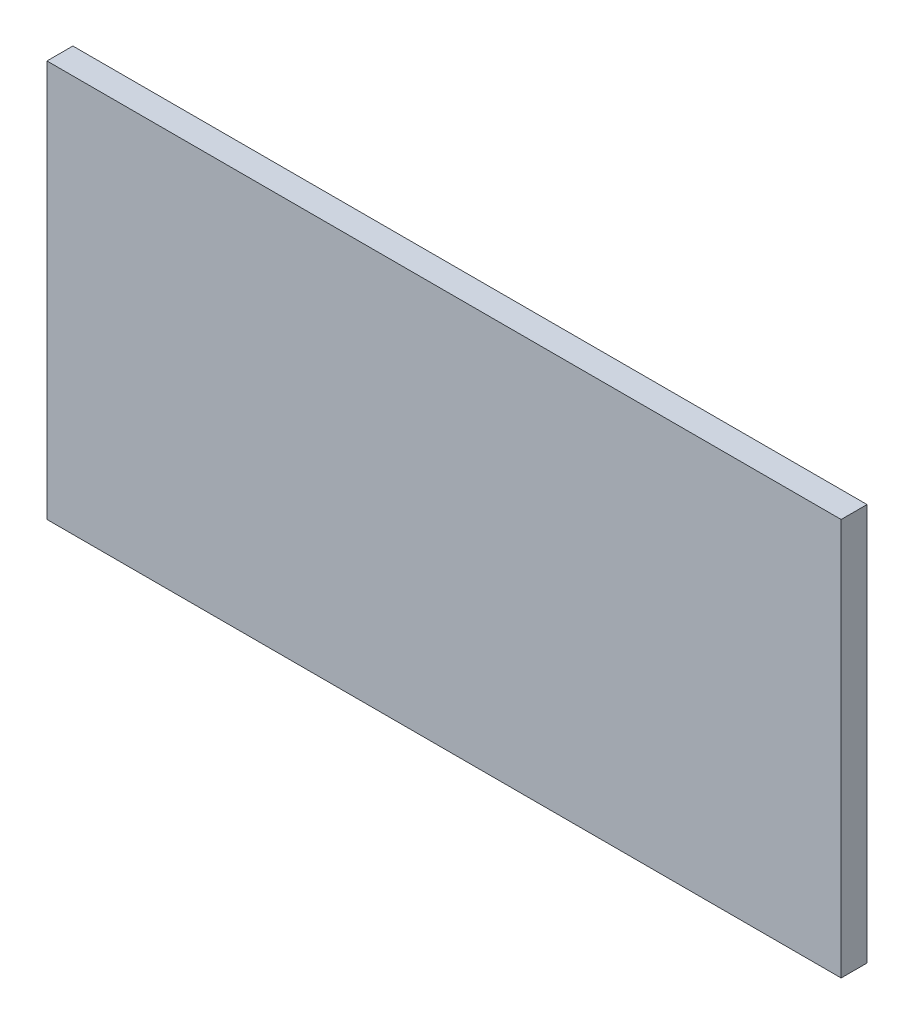
ISO-10303-21;
HEADER;
FILE_DESCRIPTION(('STEP AP214'),'2;1');
FILE_NAME('part.step','',(''),(''),'','','');
FILE_SCHEMA(('AUTOMOTIVE_DESIGN { 1 0 10303 214 1 1 1 1 }'));
ENDSEC;
DATA;
#1=APPLICATION_CONTEXT('core data for automotive mechanical design processes');
#2=APPLICATION_PROTOCOL_DEFINITION('international standard','automotive_design',2000,#1);
#3=PRODUCT_CONTEXT('',#1,'mechanical');
#4=PRODUCT('Part','Part','',(#3));
#5=PRODUCT_RELATED_PRODUCT_CATEGORY('part','',(#4));
#6=PRODUCT_DEFINITION_FORMATION('','',#4);
#7=PRODUCT_DEFINITION_CONTEXT('part definition',#1,'design');
#8=PRODUCT_DEFINITION('design','',#6,#7);
#9=PRODUCT_DEFINITION_SHAPE('','',#8);
#10=(LENGTH_UNIT() NAMED_UNIT(*) SI_UNIT(.MILLI.,.METRE.));
#11=(NAMED_UNIT(*) PLANE_ANGLE_UNIT() SI_UNIT($,.RADIAN.));
#12=(NAMED_UNIT(*) SI_UNIT($,.STERADIAN.) SOLID_ANGLE_UNIT());
#13=UNCERTAINTY_MEASURE_WITH_UNIT(LENGTH_MEASURE(1.E-05),#10,'distance_accuracy_value','');
#14=(GEOMETRIC_REPRESENTATION_CONTEXT(3) GLOBAL_UNCERTAINTY_ASSIGNED_CONTEXT((#13)) GLOBAL_UNIT_ASSIGNED_CONTEXT((#10,
#11,#12)) REPRESENTATION_CONTEXT('',''));
#15=CARTESIAN_POINT('',(0.,0.,0.));
#16=DIRECTION('',(0.,0.,1.));
#17=DIRECTION('',(1.,0.,0.));
#18=AXIS2_PLACEMENT_3D('',#15,#16,#17);
#19=CARTESIAN_POINT('',(46.,23.,3.));
#20=DIRECTION('',(-1.,0.,0.));
#21=DIRECTION('',(0.,-1.,0.));
#22=AXIS2_PLACEMENT_3D('',#19,#20,#21);
#23=PLANE('',#22);
#24=DIRECTION('',(0.,1.,0.));
#25=VECTOR('',#24,1.);
#26=CARTESIAN_POINT('',(46.,23.,0.));
#27=LINE('',#26,#25);
#28=CARTESIAN_POINT('',(46.,-23.,0.));
#29=VERTEX_POINT('',#28);
#30=CARTESIAN_POINT('',(46.,23.,0.));
#31=VERTEX_POINT('',#30);
#32=EDGE_CURVE('E96',#29,#31,#27,.T.);
#33=ORIENTED_EDGE('',*,*,#32,.T.);
#34=DIRECTION('',(0.,0.,-1.));
#35=VECTOR('',#34,1.);
#36=CARTESIAN_POINT('',(46.,23.,3.));
#37=LINE('',#36,#35);
#38=CARTESIAN_POINT('',(46.,23.,3.));
#39=VERTEX_POINT('',#38);
#40=EDGE_CURVE('E11',#39,#31,#37,.T.);
#41=ORIENTED_EDGE('',*,*,#40,.F.);
#42=DIRECTION('',(0.,1.,0.));
#43=VECTOR('',#42,1.);
#44=CARTESIAN_POINT('',(46.,23.,3.));
#45=LINE('',#44,#43);
#46=CARTESIAN_POINT('',(46.,-23.,3.));
#47=VERTEX_POINT('',#46);
#48=EDGE_CURVE('E84',#47,#39,#45,.T.);
#49=ORIENTED_EDGE('',*,*,#48,.F.);
#50=DIRECTION('',(0.,0.,-1.));
#51=VECTOR('',#50,1.);
#52=CARTESIAN_POINT('',(46.,-23.,3.));
#53=LINE('',#52,#51);
#54=EDGE_CURVE('E92',#47,#29,#53,.T.);
#55=ORIENTED_EDGE('',*,*,#54,.T.);
#56=EDGE_LOOP('',(#33,#41,#49,#55));
#57=FACE_BOUND('',#56,.T.);
#58=ADVANCED_FACE('F33',(#57),#23,.F.);
#59=CARTESIAN_POINT('',(-46.,23.,3.));
#60=DIRECTION('',(0.,-1.,0.));
#61=DIRECTION('',(0.,0.,-1.));
#62=AXIS2_PLACEMENT_3D('',#59,#60,#61);
#63=PLANE('',#62);
#64=DIRECTION('',(-1.,0.,0.));
#65=VECTOR('',#64,1.);
#66=CARTESIAN_POINT('',(-46.,23.,0.));
#67=LINE('',#66,#65);
#68=CARTESIAN_POINT('',(-46.,23.,0.));
#69=VERTEX_POINT('',#68);
#70=EDGE_CURVE('E88',#31,#69,#67,.T.);
#71=ORIENTED_EDGE('',*,*,#70,.T.);
#72=DIRECTION('',(0.,0.,-1.));
#73=VECTOR('',#72,1.);
#74=CARTESIAN_POINT('',(-46.,23.,3.));
#75=LINE('',#74,#73);
#76=CARTESIAN_POINT('',(-46.,23.,3.));
#77=VERTEX_POINT('',#76);
#78=EDGE_CURVE('E41',#77,#69,#75,.T.);
#79=ORIENTED_EDGE('',*,*,#78,.F.);
#80=DIRECTION('',(-1.,0.,0.));
#81=VECTOR('',#80,1.);
#82=CARTESIAN_POINT('',(-46.,23.,3.));
#83=LINE('',#82,#81);
#84=EDGE_CURVE('E79',#39,#77,#83,.T.);
#85=ORIENTED_EDGE('',*,*,#84,.F.);
#86=ORIENTED_EDGE('',*,*,#40,.T.);
#87=EDGE_LOOP('',(#71,#79,#85,#86));
#88=FACE_BOUND('',#87,.T.);
#89=ADVANCED_FACE('F87',(#88),#63,.F.);
#90=CARTESIAN_POINT('',(-46.,23.,3.));
#91=DIRECTION('',(1.,0.,0.));
#92=DIRECTION('',(0.,1.,0.));
#93=AXIS2_PLACEMENT_3D('',#90,#91,#92);
#94=PLANE('',#93);
#95=DIRECTION('',(0.,-1.,0.));
#96=VECTOR('',#95,1.);
#97=CARTESIAN_POINT('',(-46.,23.,0.));
#98=LINE('',#97,#96);
#99=CARTESIAN_POINT('',(-46.,-23.,0.));
#100=VERTEX_POINT('',#99);
#101=EDGE_CURVE('E66',#69,#100,#98,.T.);
#102=ORIENTED_EDGE('',*,*,#101,.T.);
#103=DIRECTION('',(0.,0.,-1.));
#104=VECTOR('',#103,1.);
#105=CARTESIAN_POINT('',(-46.,-23.,3.));
#106=LINE('',#105,#104);
#107=CARTESIAN_POINT('',(-46.,-23.,3.));
#108=VERTEX_POINT('',#107);
#109=EDGE_CURVE('E89',#108,#100,#106,.T.);
#110=ORIENTED_EDGE('',*,*,#109,.F.);
#111=DIRECTION('',(0.,-1.,0.));
#112=VECTOR('',#111,1.);
#113=CARTESIAN_POINT('',(-46.,23.,3.));
#114=LINE('',#113,#112);
#115=EDGE_CURVE('E82',#77,#108,#114,.T.);
#116=ORIENTED_EDGE('',*,*,#115,.F.);
#117=ORIENTED_EDGE('',*,*,#78,.T.);
#118=EDGE_LOOP('',(#102,#110,#116,#117));
#119=FACE_BOUND('',#118,.T.);
#120=ADVANCED_FACE('F90',(#119),#94,.F.);
#121=CARTESIAN_POINT('',(-46.,-23.,3.));
#122=DIRECTION('',(0.,1.,0.));
#123=DIRECTION('',(0.,0.,1.));
#124=AXIS2_PLACEMENT_3D('',#121,#122,#123);
#125=PLANE('',#124);
#126=DIRECTION('',(1.,0.,0.));
#127=VECTOR('',#126,1.);
#128=CARTESIAN_POINT('',(-46.,-23.,0.));
#129=LINE('',#128,#127);
#130=EDGE_CURVE('E72',#100,#29,#129,.T.);
#131=ORIENTED_EDGE('',*,*,#130,.T.);
#132=ORIENTED_EDGE('',*,*,#54,.F.);
#133=DIRECTION('',(1.,0.,0.));
#134=VECTOR('',#133,1.);
#135=CARTESIAN_POINT('',(-46.,-23.,3.));
#136=LINE('',#135,#134);
#137=EDGE_CURVE('E49',#108,#47,#136,.T.);
#138=ORIENTED_EDGE('',*,*,#137,.F.);
#139=ORIENTED_EDGE('',*,*,#109,.T.);
#140=EDGE_LOOP('',(#131,#132,#138,#139));
#141=FACE_BOUND('',#140,.T.);
#142=ADVANCED_FACE('F103',(#141),#125,.F.);
#143=CARTESIAN_POINT('',(0.,0.,3.));
#144=DIRECTION('',(0.,0.,1.));
#145=DIRECTION('',(1.,0.,0.));
#146=AXIS2_PLACEMENT_3D('',#143,#144,#145);
#147=PLANE('',#146);
#148=ORIENTED_EDGE('',*,*,#48,.T.);
#149=ORIENTED_EDGE('',*,*,#84,.T.);
#150=ORIENTED_EDGE('',*,*,#115,.T.);
#151=ORIENTED_EDGE('',*,*,#137,.T.);
#152=EDGE_LOOP('',(#148,#149,#150,#151));
#153=FACE_BOUND('',#152,.T.);
#154=ADVANCED_FACE('F80',(#153),#147,.T.);
#155=CARTESIAN_POINT('',(0.,0.,0.));
#156=DIRECTION('',(0.,0.,1.));
#157=DIRECTION('',(1.,0.,0.));
#158=AXIS2_PLACEMENT_3D('',#155,#156,#157);
#159=PLANE('',#158);
#160=ORIENTED_EDGE('',*,*,#32,.F.);
#161=ORIENTED_EDGE('',*,*,#130,.F.);
#162=ORIENTED_EDGE('',*,*,#101,.F.);
#163=ORIENTED_EDGE('',*,*,#70,.F.);
#164=EDGE_LOOP('',(#160,#161,#162,#163));
#165=FACE_BOUND('',#164,.T.);
#166=ADVANCED_FACE('F106',(#165),#159,.F.);
#167=CLOSED_SHELL('',(#58,#89,#120,#142,#154,#166));
#168=MANIFOLD_SOLID_BREP('B2',#167);
#169=ADVANCED_BREP_SHAPE_REPRESENTATION('',(#18,#168),#14);
#170=SHAPE_DEFINITION_REPRESENTATION(#9,#169);
ENDSEC;
END-ISO-10303-21;
